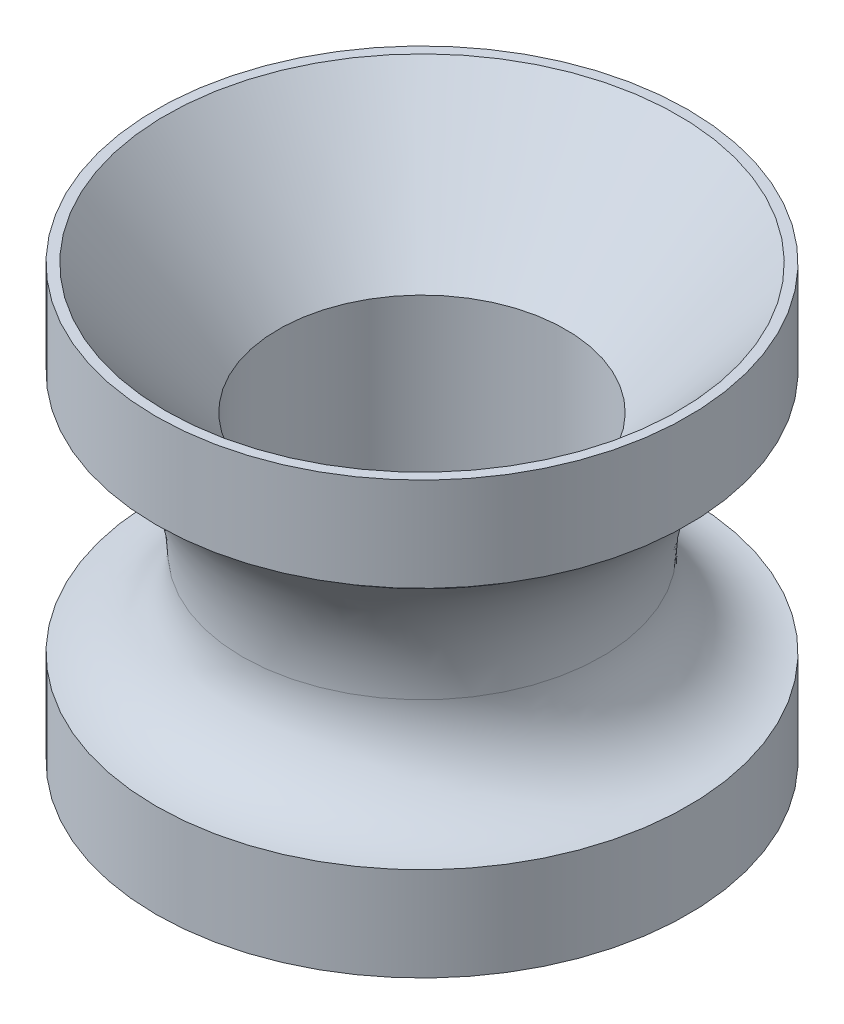
ISO-10303-21;
HEADER;
FILE_DESCRIPTION(('STEP AP214'),'2;1');
FILE_NAME('part.step','',(''),(''),'','','');
FILE_SCHEMA(('AUTOMOTIVE_DESIGN { 1 0 10303 214 1 1 1 1 }'));
ENDSEC;
DATA;
#1=APPLICATION_CONTEXT('core data for automotive mechanical design processes');
#2=APPLICATION_PROTOCOL_DEFINITION('international standard','automotive_design',2000,#1);
#3=PRODUCT_CONTEXT('',#1,'mechanical');
#4=PRODUCT('Part','Part','',(#3));
#5=PRODUCT_RELATED_PRODUCT_CATEGORY('part','',(#4));
#6=PRODUCT_DEFINITION_FORMATION('','',#4);
#7=PRODUCT_DEFINITION_CONTEXT('part definition',#1,'design');
#8=PRODUCT_DEFINITION('design','',#6,#7);
#9=PRODUCT_DEFINITION_SHAPE('','',#8);
#10=(LENGTH_UNIT() NAMED_UNIT(*) SI_UNIT(.MILLI.,.METRE.));
#11=(NAMED_UNIT(*) PLANE_ANGLE_UNIT() SI_UNIT($,.RADIAN.));
#12=(NAMED_UNIT(*) SI_UNIT($,.STERADIAN.) SOLID_ANGLE_UNIT());
#13=UNCERTAINTY_MEASURE_WITH_UNIT(LENGTH_MEASURE(1.E-05),#10,'distance_accuracy_value','');
#14=(GEOMETRIC_REPRESENTATION_CONTEXT(3) GLOBAL_UNCERTAINTY_ASSIGNED_CONTEXT((#13)) GLOBAL_UNIT_ASSIGNED_CONTEXT((#10,
#11,#12)) REPRESENTATION_CONTEXT('',''));
#15=CARTESIAN_POINT('',(0.,0.,0.));
#16=DIRECTION('',(0.,0.,1.));
#17=DIRECTION('',(1.,0.,0.));
#18=AXIS2_PLACEMENT_3D('',#15,#16,#17);
#19=CARTESIAN_POINT('',(4.699,7.62,0.));
#20=DIRECTION('',(0.,-1.,0.));
#21=DIRECTION('',(0.,0.,-1.));
#22=AXIS2_PLACEMENT_3D('',#19,#20,#21);
#23=PLANE('',#22);
#24=CARTESIAN_POINT('',(0.,7.62,0.));
#25=DIRECTION('',(0.,1.,0.));
#26=DIRECTION('',(0.,0.,1.));
#27=AXIS2_PLACEMENT_3D('',#24,#25,#26);
#28=CIRCLE('',#27,4.5271894826479);
#29=CARTESIAN_POINT('',(0.,7.62,4.5271894826479));
#30=VERTEX_POINT('',#29);
#31=EDGE_CURVE('E74',#30,#30,#28,.T.);
#32=ORIENTED_EDGE('',*,*,#31,.F.);
#33=EDGE_LOOP('',(#32));
#34=FACE_BOUND('',#33,.T.);
#35=CARTESIAN_POINT('',(0.,7.62,0.));
#36=DIRECTION('',(0.,1.,0.));
#37=DIRECTION('',(0.,0.,1.));
#38=AXIS2_PLACEMENT_3D('',#35,#36,#37);
#39=CIRCLE('',#38,4.699);
#40=CARTESIAN_POINT('',(0.,7.62,4.699));
#41=VERTEX_POINT('',#40);
#42=EDGE_CURVE('E10',#41,#41,#39,.T.);
#43=ORIENTED_EDGE('',*,*,#42,.T.);
#44=EDGE_LOOP('',(#43));
#45=FACE_BOUND('',#44,.T.);
#46=ADVANCED_FACE('F39',(#34,#45),#23,.F.);
#47=CARTESIAN_POINT('',(0.,7.62,0.));
#48=DIRECTION('',(0.,1.,0.));
#49=DIRECTION('',(0.,0.,1.));
#50=AXIS2_PLACEMENT_3D('',#47,#48,#49);
#51=CYLINDRICAL_SURFACE('',#50,4.699);
#52=ORIENTED_EDGE('',*,*,#42,.F.);
#53=EDGE_LOOP('',(#52));
#54=FACE_BOUND('',#53,.T.);
#55=CARTESIAN_POINT('',(0.,5.96321537207593,0.));
#56=DIRECTION('',(0.,1.,0.));
#57=DIRECTION('',(0.,0.,1.));
#58=AXIS2_PLACEMENT_3D('',#55,#56,#57);
#59=CIRCLE('',#58,4.699);
#60=CARTESIAN_POINT('',(0.,5.96321537207593,4.699));
#61=VERTEX_POINT('',#60);
#62=EDGE_CURVE('E46',#61,#61,#59,.T.);
#63=ORIENTED_EDGE('',*,*,#62,.T.);
#64=EDGE_LOOP('',(#63));
#65=FACE_BOUND('',#64,.T.);
#66=ADVANCED_FACE('F83',(#54,#65),#51,.T.);
#67=CARTESIAN_POINT('',(0.,3.18078477994968,0.));
#68=DIRECTION('',(0.,1.,0.));
#69=DIRECTION('',(0.,0.,1.));
#70=AXIS2_PLACEMENT_3D('',#67,#68,#69);
#71=TOROIDAL_SURFACE('',#70,6.477,3.30200000000001);
#72=ORIENTED_EDGE('',*,*,#62,.F.);
#73=EDGE_LOOP('',(#72));
#74=FACE_BOUND('',#73,.T.);
#75=CARTESIAN_POINT('',(0.,3.18078449761641,0.));
#76=DIRECTION('',(0.,1.,0.));
#77=DIRECTION('',(0.,0.,1.));
#78=AXIS2_PLACEMENT_3D('',#75,#76,#77);
#79=CIRCLE('',#78,3.175);
#80=CARTESIAN_POINT('',(0.,3.18078449761641,3.175));
#81=VERTEX_POINT('',#80);
#82=EDGE_CURVE('E51',#81,#81,#79,.T.);
#83=ORIENTED_EDGE('',*,*,#82,.T.);
#84=EDGE_LOOP('',(#83));
#85=FACE_BOUND('',#84,.T.);
#86=ADVANCED_FACE('F87',(#74,#85),#71,.F.);
#87=CARTESIAN_POINT('',(0.,3.18078462792407,0.));
#88=DIRECTION('',(0.,1.,0.));
#89=DIRECTION('',(0.,0.,1.));
#90=AXIS2_PLACEMENT_3D('',#87,#88,#89);
#91=TOROIDAL_SURFACE('',#90,4.699,1.524);
#92=ORIENTED_EDGE('',*,*,#82,.F.);
#93=EDGE_LOOP('',(#92));
#94=FACE_BOUND('',#93,.T.);
#95=CARTESIAN_POINT('',(0.,1.65678462792407,0.));
#96=DIRECTION('',(0.,1.,0.));
#97=DIRECTION('',(0.,0.,1.));
#98=AXIS2_PLACEMENT_3D('',#95,#96,#97);
#99=CIRCLE('',#98,4.699);
#100=CARTESIAN_POINT('',(0.,1.65678462792407,4.699));
#101=VERTEX_POINT('',#100);
#102=EDGE_CURVE('E56',#101,#101,#99,.T.);
#103=ORIENTED_EDGE('',*,*,#102,.T.);
#104=EDGE_LOOP('',(#103));
#105=FACE_BOUND('',#104,.T.);
#106=ADVANCED_FACE('F92',(#94,#105),#91,.F.);
#107=CARTESIAN_POINT('',(0.,7.62,0.));
#108=DIRECTION('',(0.,1.,0.));
#109=DIRECTION('',(0.,0.,1.));
#110=AXIS2_PLACEMENT_3D('',#107,#108,#109);
#111=CYLINDRICAL_SURFACE('',#110,4.699);
#112=ORIENTED_EDGE('',*,*,#102,.F.);
#113=EDGE_LOOP('',(#112));
#114=FACE_BOUND('',#113,.T.);
#115=CARTESIAN_POINT('',(0.,0.,0.));
#116=DIRECTION('',(0.,1.,0.));
#117=DIRECTION('',(0.,0.,1.));
#118=AXIS2_PLACEMENT_3D('',#115,#116,#117);
#119=CIRCLE('',#118,4.699);
#120=CARTESIAN_POINT('',(0.,0.,4.699));
#121=VERTEX_POINT('',#120);
#122=EDGE_CURVE('E62',#121,#121,#119,.T.);
#123=ORIENTED_EDGE('',*,*,#122,.T.);
#124=EDGE_LOOP('',(#123));
#125=FACE_BOUND('',#124,.T.);
#126=ADVANCED_FACE('F98',(#114,#125),#111,.T.);
#127=CARTESIAN_POINT('',(0.,0.,0.));
#128=DIRECTION('',(0.,1.,0.));
#129=DIRECTION('',(0.,0.,1.));
#130=AXIS2_PLACEMENT_3D('',#127,#128,#129);
#131=PLANE('',#130);
#132=CARTESIAN_POINT('',(0.,0.,0.));
#133=DIRECTION('',(0.,1.,0.));
#134=DIRECTION('',(0.,0.,1.));
#135=AXIS2_PLACEMENT_3D('',#132,#133,#134);
#136=CIRCLE('',#135,2.54);
#137=CARTESIAN_POINT('',(0.,0.,2.54));
#138=VERTEX_POINT('',#137);
#139=EDGE_CURVE('E66',#138,#138,#136,.T.);
#140=ORIENTED_EDGE('',*,*,#139,.T.);
#141=EDGE_LOOP('',(#140));
#142=FACE_BOUND('',#141,.T.);
#143=ORIENTED_EDGE('',*,*,#122,.F.);
#144=EDGE_LOOP('',(#143));
#145=FACE_BOUND('',#144,.T.);
#146=ADVANCED_FACE('F102',(#142,#145),#131,.F.);
#147=CARTESIAN_POINT('',(0.,7.62,0.));
#148=DIRECTION('',(0.,1.,0.));
#149=DIRECTION('',(0.,0.,1.));
#150=AXIS2_PLACEMENT_3D('',#147,#148,#149);
#151=CYLINDRICAL_SURFACE('',#150,2.54);
#152=CARTESIAN_POINT('',(0.,5.334,0.));
#153=DIRECTION('',(0.,1.,0.));
#154=DIRECTION('',(0.,0.,1.));
#155=AXIS2_PLACEMENT_3D('',#152,#153,#154);
#156=CIRCLE('',#155,2.54);
#157=CARTESIAN_POINT('',(0.,5.334,2.54));
#158=VERTEX_POINT('',#157);
#159=EDGE_CURVE('E70',#158,#158,#156,.T.);
#160=ORIENTED_EDGE('',*,*,#159,.T.);
#161=EDGE_LOOP('',(#160));
#162=FACE_BOUND('',#161,.T.);
#163=ORIENTED_EDGE('',*,*,#139,.F.);
#164=EDGE_LOOP('',(#163));
#165=FACE_BOUND('',#164,.T.);
#166=ADVANCED_FACE('F106',(#162,#165),#151,.F.);
#167=CARTESIAN_POINT('',(0.,5.334,0.));
#168=DIRECTION('',(0.,1.,0.));
#169=DIRECTION('',(0.,0.,1.));
#170=AXIS2_PLACEMENT_3D('',#167,#168,#169);
#171=CONICAL_SURFACE('',#170,2.54,0.715584993317677);
#172=ORIENTED_EDGE('',*,*,#31,.T.);
#173=EDGE_LOOP('',(#172));
#174=FACE_BOUND('',#173,.T.);
#175=ORIENTED_EDGE('',*,*,#159,.F.);
#176=EDGE_LOOP('',(#175));
#177=FACE_BOUND('',#176,.T.);
#178=ADVANCED_FACE('F79',(#174,#177),#171,.F.);
#179=CLOSED_SHELL('',(#46,#66,#86,#106,#126,#146,#166,#178));
#180=MANIFOLD_SOLID_BREP('B2',#179);
#181=ADVANCED_BREP_SHAPE_REPRESENTATION('',(#18,#180),#14);
#182=SHAPE_DEFINITION_REPRESENTATION(#9,#181);
ENDSEC;
END-ISO-10303-21;
